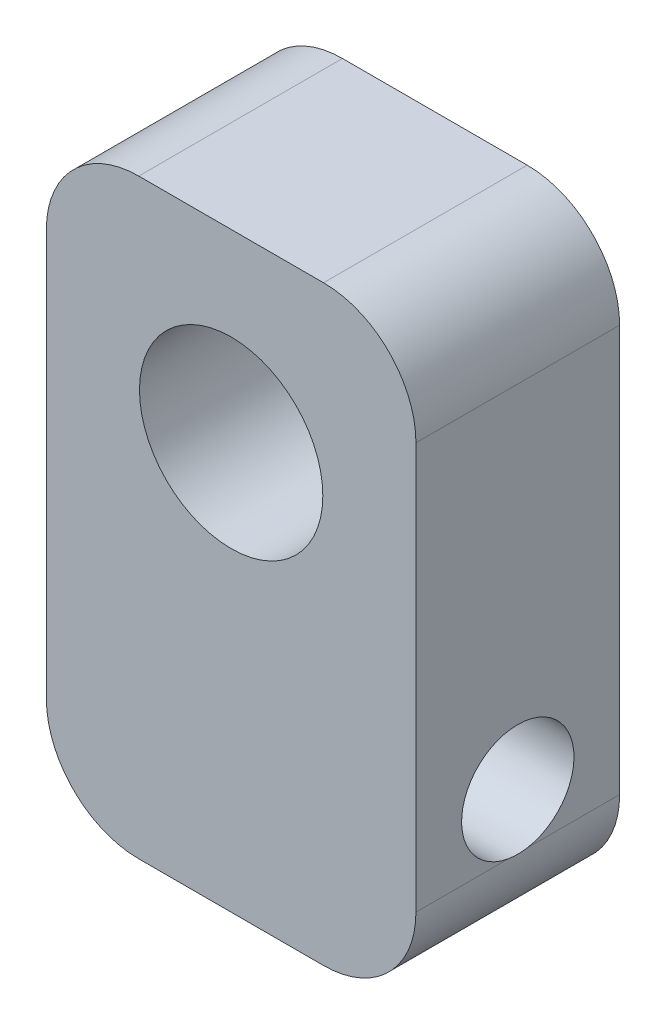
ISO-10303-21;
HEADER;
FILE_DESCRIPTION(('STEP AP214'),'2;1');
FILE_NAME('part.step','',(''),(''),'','','');
FILE_SCHEMA(('AUTOMOTIVE_DESIGN { 1 0 10303 214 1 1 1 1 }'));
ENDSEC;
DATA;
#1=APPLICATION_CONTEXT('core data for automotive mechanical design processes');
#2=APPLICATION_PROTOCOL_DEFINITION('international standard','automotive_design',2000,#1);
#3=PRODUCT_CONTEXT('',#1,'mechanical');
#4=PRODUCT('Part','Part','',(#3));
#5=PRODUCT_RELATED_PRODUCT_CATEGORY('part','',(#4));
#6=PRODUCT_DEFINITION_FORMATION('','',#4);
#7=PRODUCT_DEFINITION_CONTEXT('part definition',#1,'design');
#8=PRODUCT_DEFINITION('design','',#6,#7);
#9=PRODUCT_DEFINITION_SHAPE('','',#8);
#10=(LENGTH_UNIT() NAMED_UNIT(*) SI_UNIT(.MILLI.,.METRE.));
#11=(NAMED_UNIT(*) PLANE_ANGLE_UNIT() SI_UNIT($,.RADIAN.));
#12=(NAMED_UNIT(*) SI_UNIT($,.STERADIAN.) SOLID_ANGLE_UNIT());
#13=UNCERTAINTY_MEASURE_WITH_UNIT(LENGTH_MEASURE(1.E-05),#10,'distance_accuracy_value','');
#14=(GEOMETRIC_REPRESENTATION_CONTEXT(3) GLOBAL_UNCERTAINTY_ASSIGNED_CONTEXT((#13)) GLOBAL_UNIT_ASSIGNED_CONTEXT((#10,
#11,#12)) REPRESENTATION_CONTEXT('',''));
#15=CARTESIAN_POINT('',(0.,0.,0.));
#16=DIRECTION('',(0.,0.,1.));
#17=DIRECTION('',(1.,0.,0.));
#18=AXIS2_PLACEMENT_3D('',#15,#16,#17);
#19=CARTESIAN_POINT('',(0.,0.,3.5));
#20=DIRECTION('',(0.,0.,-1.));
#21=DIRECTION('',(-1.,0.,0.));
#22=AXIS2_PLACEMENT_3D('',#19,#20,#21);
#23=PLANE('',#22);
#24=DIRECTION('',(0.,1.,0.));
#25=VECTOR('',#24,1.);
#26=CARTESIAN_POINT('',(6.35,0.,3.5));
#27=LINE('',#26,#25);
#28=CARTESIAN_POINT('',(6.35,1.5875,3.5));
#29=VERTEX_POINT('',#28);
#30=CARTESIAN_POINT('',(6.35,8.5725,3.5));
#31=VERTEX_POINT('',#30);
#32=EDGE_CURVE('E239',#29,#31,#27,.T.);
#33=ORIENTED_EDGE('',*,*,#32,.T.);
#34=CARTESIAN_POINT('',(4.7625,8.5725,3.5));
#35=DIRECTION('',(0.,0.,-1.));
#36=DIRECTION('',(-1.,0.,0.));
#37=AXIS2_PLACEMENT_3D('',#34,#35,#36);
#38=CIRCLE('',#37,1.5875);
#39=CARTESIAN_POINT('',(4.7625,10.16,3.5));
#40=VERTEX_POINT('',#39);
#41=EDGE_CURVE('E148',#31,#40,#38,.F.);
#42=ORIENTED_EDGE('',*,*,#41,.T.);
#43=DIRECTION('',(-1.,0.,0.));
#44=VECTOR('',#43,1.);
#45=CARTESIAN_POINT('',(0.,10.16,3.5));
#46=LINE('',#45,#44);
#47=CARTESIAN_POINT('',(1.5875,10.16,3.5));
#48=VERTEX_POINT('',#47);
#49=EDGE_CURVE('E115',#40,#48,#46,.T.);
#50=ORIENTED_EDGE('',*,*,#49,.T.);
#51=CARTESIAN_POINT('',(1.5875,8.5725,3.5));
#52=DIRECTION('',(0.,0.,-1.));
#53=DIRECTION('',(-1.,0.,0.));
#54=AXIS2_PLACEMENT_3D('',#51,#52,#53);
#55=CIRCLE('',#54,1.5875);
#56=CARTESIAN_POINT('',(0.,8.5725,3.5));
#57=VERTEX_POINT('',#56);
#58=EDGE_CURVE('E144',#48,#57,#55,.F.);
#59=ORIENTED_EDGE('',*,*,#58,.T.);
#60=DIRECTION('',(0.,-1.,0.));
#61=VECTOR('',#60,1.);
#62=CARTESIAN_POINT('',(0.,0.,3.5));
#63=LINE('',#62,#61);
#64=CARTESIAN_POINT('',(0.,1.5875,3.5));
#65=VERTEX_POINT('',#64);
#66=EDGE_CURVE('E123',#57,#65,#63,.T.);
#67=ORIENTED_EDGE('',*,*,#66,.T.);
#68=CARTESIAN_POINT('',(1.5875,1.5875,3.5));
#69=DIRECTION('',(0.,0.,-1.));
#70=DIRECTION('',(-1.,0.,0.));
#71=AXIS2_PLACEMENT_3D('',#68,#69,#70);
#72=CIRCLE('',#71,1.5875);
#73=CARTESIAN_POINT('',(1.5875,0.,3.5));
#74=VERTEX_POINT('',#73);
#75=EDGE_CURVE('E142',#65,#74,#72,.F.);
#76=ORIENTED_EDGE('',*,*,#75,.T.);
#77=DIRECTION('',(1.,0.,0.));
#78=VECTOR('',#77,1.);
#79=CARTESIAN_POINT('',(0.,0.,3.5));
#80=LINE('',#79,#78);
#81=CARTESIAN_POINT('',(4.7625,0.,3.5));
#82=VERTEX_POINT('',#81);
#83=EDGE_CURVE('E127',#74,#82,#80,.T.);
#84=ORIENTED_EDGE('',*,*,#83,.T.);
#85=CARTESIAN_POINT('',(4.7625,1.5875,3.5));
#86=DIRECTION('',(0.,0.,-1.));
#87=DIRECTION('',(-1.,0.,0.));
#88=AXIS2_PLACEMENT_3D('',#85,#86,#87);
#89=CIRCLE('',#88,1.5875);
#90=EDGE_CURVE('E146',#82,#29,#89,.F.);
#91=ORIENTED_EDGE('',*,*,#90,.T.);
#92=EDGE_LOOP('',(#33,#42,#50,#59,#67,#76,#84,#91));
#93=FACE_BOUND('',#92,.T.);
#94=CARTESIAN_POINT('',(3.175,6.985,3.5));
#95=DIRECTION('',(0.,0.,1.));
#96=DIRECTION('',(1.,0.,0.));
#97=AXIS2_PLACEMENT_3D('',#94,#95,#96);
#98=CIRCLE('',#97,1.575000025);
#99=CARTESIAN_POINT('',(4.750000025,6.985,3.5));
#100=VERTEX_POINT('',#99);
#101=EDGE_CURVE('E235',#100,#100,#98,.T.);
#102=ORIENTED_EDGE('',*,*,#101,.F.);
#103=EDGE_LOOP('',(#102));
#104=FACE_BOUND('',#103,.T.);
#105=ADVANCED_FACE('F17',(#93,#104),#23,.F.);
#106=CARTESIAN_POINT('',(0.,0.,0.));
#107=DIRECTION('',(0.,0.,-1.));
#108=DIRECTION('',(-1.,0.,0.));
#109=AXIS2_PLACEMENT_3D('',#106,#107,#108);
#110=PLANE('',#109);
#111=DIRECTION('',(-1.,0.,0.));
#112=VECTOR('',#111,1.);
#113=CARTESIAN_POINT('',(0.,10.16,0.));
#114=LINE('',#113,#112);
#115=CARTESIAN_POINT('',(4.7625,10.16,0.));
#116=VERTEX_POINT('',#115);
#117=CARTESIAN_POINT('',(1.5875,10.16,0.));
#118=VERTEX_POINT('',#117);
#119=EDGE_CURVE('E112',#116,#118,#114,.T.);
#120=ORIENTED_EDGE('',*,*,#119,.F.);
#121=CARTESIAN_POINT('',(4.7625,8.5725,0.));
#122=DIRECTION('',(0.,0.,-1.));
#123=DIRECTION('',(-1.,0.,0.));
#124=AXIS2_PLACEMENT_3D('',#121,#122,#123);
#125=CIRCLE('',#124,1.5875);
#126=CARTESIAN_POINT('',(6.35,8.5725,0.));
#127=VERTEX_POINT('',#126);
#128=EDGE_CURVE('E95',#116,#127,#125,.T.);
#129=ORIENTED_EDGE('',*,*,#128,.T.);
#130=DIRECTION('',(0.,1.,0.));
#131=VECTOR('',#130,1.);
#132=CARTESIAN_POINT('',(6.35,0.,0.));
#133=LINE('',#132,#131);
#134=CARTESIAN_POINT('',(6.35,1.5875,0.));
#135=VERTEX_POINT('',#134);
#136=EDGE_CURVE('E124',#135,#127,#133,.T.);
#137=ORIENTED_EDGE('',*,*,#136,.F.);
#138=CARTESIAN_POINT('',(4.7625,1.5875,0.));
#139=DIRECTION('',(0.,0.,-1.));
#140=DIRECTION('',(-1.,0.,0.));
#141=AXIS2_PLACEMENT_3D('',#138,#139,#140);
#142=CIRCLE('',#141,1.5875);
#143=CARTESIAN_POINT('',(4.7625,0.,0.));
#144=VERTEX_POINT('',#143);
#145=EDGE_CURVE('E106',#135,#144,#142,.T.);
#146=ORIENTED_EDGE('',*,*,#145,.T.);
#147=DIRECTION('',(1.,0.,0.));
#148=VECTOR('',#147,1.);
#149=CARTESIAN_POINT('',(0.,0.,0.));
#150=LINE('',#149,#148);
#151=CARTESIAN_POINT('',(1.5875,0.,0.));
#152=VERTEX_POINT('',#151);
#153=EDGE_CURVE('E129',#152,#144,#150,.T.);
#154=ORIENTED_EDGE('',*,*,#153,.F.);
#155=CARTESIAN_POINT('',(1.5875,1.5875,0.));
#156=DIRECTION('',(0.,0.,-1.));
#157=DIRECTION('',(-1.,0.,0.));
#158=AXIS2_PLACEMENT_3D('',#155,#156,#157);
#159=CIRCLE('',#158,1.5875);
#160=CARTESIAN_POINT('',(0.,1.5875,0.));
#161=VERTEX_POINT('',#160);
#162=EDGE_CURVE('E116',#152,#161,#159,.T.);
#163=ORIENTED_EDGE('',*,*,#162,.T.);
#164=DIRECTION('',(0.,-1.,0.));
#165=VECTOR('',#164,1.);
#166=CARTESIAN_POINT('',(0.,0.,0.));
#167=LINE('',#166,#165);
#168=CARTESIAN_POINT('',(0.,8.5725,0.));
#169=VERTEX_POINT('',#168);
#170=EDGE_CURVE('E234',#169,#161,#167,.T.);
#171=ORIENTED_EDGE('',*,*,#170,.F.);
#172=CARTESIAN_POINT('',(1.5875,8.5725,0.));
#173=DIRECTION('',(0.,0.,-1.));
#174=DIRECTION('',(-1.,0.,0.));
#175=AXIS2_PLACEMENT_3D('',#172,#173,#174);
#176=CIRCLE('',#175,1.5875);
#177=EDGE_CURVE('E122',#169,#118,#176,.T.);
#178=ORIENTED_EDGE('',*,*,#177,.T.);
#179=EDGE_LOOP('',(#120,#129,#137,#146,#154,#163,#171,#178));
#180=FACE_BOUND('',#179,.T.);
#181=CARTESIAN_POINT('',(3.175,6.985,0.));
#182=DIRECTION('',(0.,0.,1.));
#183=DIRECTION('',(1.,0.,0.));
#184=AXIS2_PLACEMENT_3D('',#181,#182,#183);
#185=CIRCLE('',#184,1.575000025);
#186=CARTESIAN_POINT('',(4.750000025,6.985,0.));
#187=VERTEX_POINT('',#186);
#188=EDGE_CURVE('E242',#187,#187,#185,.T.);
#189=ORIENTED_EDGE('',*,*,#188,.T.);
#190=EDGE_LOOP('',(#189));
#191=FACE_BOUND('',#190,.T.);
#192=ADVANCED_FACE('F119',(#180,#191),#110,.T.);
#193=CARTESIAN_POINT('',(0.,0.,3.5));
#194=DIRECTION('',(1.,0.,0.));
#195=DIRECTION('',(0.,0.,-1.));
#196=AXIS2_PLACEMENT_3D('',#193,#194,#195);
#197=PLANE('',#196);
#198=ORIENTED_EDGE('',*,*,#66,.F.);
#199=DIRECTION('',(0.,0.,-1.));
#200=VECTOR('',#199,1.);
#201=CARTESIAN_POINT('',(0.,8.5725,3.5));
#202=LINE('',#201,#200);
#203=EDGE_CURVE('E11',#57,#169,#202,.T.);
#204=ORIENTED_EDGE('',*,*,#203,.T.);
#205=ORIENTED_EDGE('',*,*,#170,.T.);
#206=DIRECTION('',(0.,0.,-1.));
#207=VECTOR('',#206,1.);
#208=CARTESIAN_POINT('',(0.,1.5875,3.5));
#209=LINE('',#208,#207);
#210=CARTESIAN_POINT('',(0.,1.5875,1.59393978726145));
#211=VERTEX_POINT('',#210);
#212=EDGE_CURVE('E26',#161,#211,#209,.F.);
#213=ORIENTED_EDGE('',*,*,#212,.T.);
#214=CARTESIAN_POINT('',(0.,2.54,1.75));
#215=DIRECTION('',(1.,0.,0.));
#216=DIRECTION('',(0.,0.,-1.));
#217=AXIS2_PLACEMENT_3D('',#214,#215,#216);
#218=CIRCLE('',#217,0.9652);
#219=CARTESIAN_POINT('',(0.,1.5875,1.90606021273855));
#220=VERTEX_POINT('',#219);
#221=EDGE_CURVE('E212',#211,#220,#218,.T.);
#222=ORIENTED_EDGE('',*,*,#221,.T.);
#223=DIRECTION('',(0.,0.,-1.));
#224=VECTOR('',#223,1.);
#225=CARTESIAN_POINT('',(0.,1.5875,3.5));
#226=LINE('',#225,#224);
#227=EDGE_CURVE('E211',#220,#65,#226,.F.);
#228=ORIENTED_EDGE('',*,*,#227,.T.);
#229=EDGE_LOOP('',(#198,#204,#205,#213,#222,#228));
#230=FACE_BOUND('',#229,.T.);
#231=ADVANCED_FACE('F177',(#230),#197,.F.);
#232=CARTESIAN_POINT('',(0.,0.,3.5));
#233=DIRECTION('',(0.,1.,0.));
#234=DIRECTION('',(0.,0.,1.));
#235=AXIS2_PLACEMENT_3D('',#232,#233,#234);
#236=PLANE('',#235);
#237=ORIENTED_EDGE('',*,*,#153,.T.);
#238=DIRECTION('',(0.,0.,-1.));
#239=VECTOR('',#238,1.);
#240=CARTESIAN_POINT('',(4.7625,0.,3.5));
#241=LINE('',#240,#239);
#242=EDGE_CURVE('E213',#144,#82,#241,.F.);
#243=ORIENTED_EDGE('',*,*,#242,.T.);
#244=ORIENTED_EDGE('',*,*,#83,.F.);
#245=DIRECTION('',(0.,0.,-1.));
#246=VECTOR('',#245,1.);
#247=CARTESIAN_POINT('',(1.5875,0.,3.5));
#248=LINE('',#247,#246);
#249=EDGE_CURVE('E215',#74,#152,#248,.T.);
#250=ORIENTED_EDGE('',*,*,#249,.T.);
#251=EDGE_LOOP('',(#237,#243,#244,#250));
#252=FACE_BOUND('',#251,.T.);
#253=ADVANCED_FACE('F183',(#252),#236,.F.);
#254=CARTESIAN_POINT('',(6.35,0.,3.5));
#255=DIRECTION('',(-1.,0.,0.));
#256=DIRECTION('',(0.,0.,1.));
#257=AXIS2_PLACEMENT_3D('',#254,#255,#256);
#258=PLANE('',#257);
#259=ORIENTED_EDGE('',*,*,#136,.T.);
#260=DIRECTION('',(0.,0.,-1.));
#261=VECTOR('',#260,1.);
#262=CARTESIAN_POINT('',(6.35,8.5725,3.5));
#263=LINE('',#262,#261);
#264=EDGE_CURVE('E100',#127,#31,#263,.F.);
#265=ORIENTED_EDGE('',*,*,#264,.T.);
#266=ORIENTED_EDGE('',*,*,#32,.F.);
#267=DIRECTION('',(0.,0.,-1.));
#268=VECTOR('',#267,1.);
#269=CARTESIAN_POINT('',(6.35,1.5875,3.5));
#270=LINE('',#269,#268);
#271=CARTESIAN_POINT('',(6.35,1.5875,1.90606021273855));
#272=VERTEX_POINT('',#271);
#273=EDGE_CURVE('E138',#29,#272,#270,.T.);
#274=ORIENTED_EDGE('',*,*,#273,.T.);
#275=CARTESIAN_POINT('',(6.35,2.54,1.75));
#276=DIRECTION('',(1.,0.,0.));
#277=DIRECTION('',(0.,0.,-1.));
#278=AXIS2_PLACEMENT_3D('',#275,#276,#277);
#279=CIRCLE('',#278,0.9652);
#280=CARTESIAN_POINT('',(6.35,1.5875,1.59393978726145));
#281=VERTEX_POINT('',#280);
#282=EDGE_CURVE('E225',#281,#272,#279,.T.);
#283=ORIENTED_EDGE('',*,*,#282,.F.);
#284=DIRECTION('',(0.,0.,-1.));
#285=VECTOR('',#284,1.);
#286=CARTESIAN_POINT('',(6.35,1.5875,3.5));
#287=LINE('',#286,#285);
#288=EDGE_CURVE('E105',#281,#135,#287,.T.);
#289=ORIENTED_EDGE('',*,*,#288,.T.);
#290=EDGE_LOOP('',(#259,#265,#266,#274,#283,#289));
#291=FACE_BOUND('',#290,.T.);
#292=ADVANCED_FACE('F180',(#291),#258,.F.);
#293=CARTESIAN_POINT('',(0.,10.16,3.5));
#294=DIRECTION('',(0.,-1.,0.));
#295=DIRECTION('',(0.,0.,-1.));
#296=AXIS2_PLACEMENT_3D('',#293,#294,#295);
#297=PLANE('',#296);
#298=ORIENTED_EDGE('',*,*,#49,.F.);
#299=DIRECTION('',(0.,0.,-1.));
#300=VECTOR('',#299,1.);
#301=CARTESIAN_POINT('',(4.7625,10.16,3.5));
#302=LINE('',#301,#300);
#303=EDGE_CURVE('E99',#40,#116,#302,.T.);
#304=ORIENTED_EDGE('',*,*,#303,.T.);
#305=ORIENTED_EDGE('',*,*,#119,.T.);
#306=DIRECTION('',(0.,0.,-1.));
#307=VECTOR('',#306,1.);
#308=CARTESIAN_POINT('',(1.5875,10.16,3.5));
#309=LINE('',#308,#307);
#310=EDGE_CURVE('E117',#118,#48,#309,.F.);
#311=ORIENTED_EDGE('',*,*,#310,.T.);
#312=EDGE_LOOP('',(#298,#304,#305,#311));
#313=FACE_BOUND('',#312,.T.);
#314=ADVANCED_FACE('F111',(#313),#297,.F.);
#315=CARTESIAN_POINT('',(3.175,6.985,3.5));
#316=DIRECTION('',(0.,0.,-1.));
#317=DIRECTION('',(-1.,0.,0.));
#318=AXIS2_PLACEMENT_3D('',#315,#316,#317);
#319=CYLINDRICAL_SURFACE('',#318,1.575000025);
#320=ORIENTED_EDGE('',*,*,#101,.T.);
#321=EDGE_LOOP('',(#320));
#322=FACE_BOUND('',#321,.T.);
#323=ORIENTED_EDGE('',*,*,#188,.F.);
#324=EDGE_LOOP('',(#323));
#325=FACE_BOUND('',#324,.T.);
#326=ADVANCED_FACE('F167',(#322,#325),#319,.F.);
#327=CARTESIAN_POINT('',(0.,2.54,1.75));
#328=DIRECTION('',(1.,0.,0.));
#329=DIRECTION('',(0.,0.,-1.));
#330=AXIS2_PLACEMENT_3D('',#327,#328,#329);
#331=CYLINDRICAL_SURFACE('',#330,0.9652);
#332=ORIENTED_EDGE('',*,*,#221,.F.);
#333=CARTESIAN_POINT('',(0.,1.5875,1.59393978726145));
#334=CARTESIAN_POINT('',(3.38672085160489E-05,1.57903333333333,1.6459598581743));
#335=CARTESIAN_POINT('',(5.08008127740759E-05,1.5748,1.69797992908715));
#336=CARTESIAN_POINT('',(5.08008127740864E-05,1.5748,1.80202007091285));
#337=CARTESIAN_POINT('',(3.38672085160698E-05,1.57903333333333,1.8540401418257));
#338=CARTESIAN_POINT('',(0.,1.5875,1.90606021273855));
#339=B_SPLINE_CURVE_WITH_KNOTS('',3,(#333,#334,#335,#336,#337,#338),.UNSPECIFIED.,.F.,.F.,(4,2,
4),(0.,0.156576123916523,0.313152247833047),.UNSPECIFIED.);
#340=EDGE_CURVE('E38',#211,#220,#339,.T.);
#341=ORIENTED_EDGE('',*,*,#340,.T.);
#342=EDGE_LOOP('',(#332,#341));
#343=FACE_BOUND('',#342,.T.);
#344=ORIENTED_EDGE('',*,*,#282,.T.);
#345=CARTESIAN_POINT('',(6.35,1.5875,1.90606021273855));
#346=CARTESIAN_POINT('',(6.34996613279148,1.57903333333333,1.8540401418257));
#347=CARTESIAN_POINT('',(6.34994919918723,1.5748,1.80202007091285));
#348=CARTESIAN_POINT('',(6.34994919918723,1.5748,1.69797992908715));
#349=CARTESIAN_POINT('',(6.34996613279148,1.57903333333333,1.6459598581743));
#350=CARTESIAN_POINT('',(6.35,1.5875,1.59393978726145));
#351=B_SPLINE_CURVE_WITH_KNOTS('',3,(#345,#346,#347,#348,#349,#350),.UNSPECIFIED.,.F.,.F.,(4,2,
4),(0.,0.156576123916523,0.313152247833047),.UNSPECIFIED.);
#352=EDGE_CURVE('E156',#272,#281,#351,.T.);
#353=ORIENTED_EDGE('',*,*,#352,.T.);
#354=EDGE_LOOP('',(#344,#353));
#355=FACE_BOUND('',#354,.T.);
#356=ADVANCED_FACE('F163',(#343,#355),#331,.F.);
#357=CARTESIAN_POINT('',(4.7625,8.5725,3.5));
#358=DIRECTION('',(0.,0.,-1.));
#359=DIRECTION('',(-1.,0.,0.));
#360=AXIS2_PLACEMENT_3D('',#357,#358,#359);
#361=CYLINDRICAL_SURFACE('',#360,1.5875);
#362=ORIENTED_EDGE('',*,*,#41,.F.);
#363=ORIENTED_EDGE('',*,*,#264,.F.);
#364=ORIENTED_EDGE('',*,*,#128,.F.);
#365=ORIENTED_EDGE('',*,*,#303,.F.);
#366=EDGE_LOOP('',(#362,#363,#364,#365));
#367=FACE_BOUND('',#366,.T.);
#368=ADVANCED_FACE('F98',(#367),#361,.T.);
#369=CARTESIAN_POINT('',(4.7625,1.5875,3.5));
#370=DIRECTION('',(0.,0.,-1.));
#371=DIRECTION('',(-1.,0.,0.));
#372=AXIS2_PLACEMENT_3D('',#369,#370,#371);
#373=CYLINDRICAL_SURFACE('',#372,1.5875);
#374=ORIENTED_EDGE('',*,*,#90,.F.);
#375=ORIENTED_EDGE('',*,*,#242,.F.);
#376=ORIENTED_EDGE('',*,*,#145,.F.);
#377=ORIENTED_EDGE('',*,*,#288,.F.);
#378=ORIENTED_EDGE('',*,*,#352,.F.);
#379=ORIENTED_EDGE('',*,*,#273,.F.);
#380=EDGE_LOOP('',(#374,#375,#376,#377,#378,#379));
#381=FACE_BOUND('',#380,.T.);
#382=ADVANCED_FACE('F191',(#381),#373,.T.);
#383=CARTESIAN_POINT('',(1.5875,8.5725,3.5));
#384=DIRECTION('',(0.,0.,-1.));
#385=DIRECTION('',(-1.,0.,0.));
#386=AXIS2_PLACEMENT_3D('',#383,#384,#385);
#387=CYLINDRICAL_SURFACE('',#386,1.5875);
#388=ORIENTED_EDGE('',*,*,#58,.F.);
#389=ORIENTED_EDGE('',*,*,#310,.F.);
#390=ORIENTED_EDGE('',*,*,#177,.F.);
#391=ORIENTED_EDGE('',*,*,#203,.F.);
#392=EDGE_LOOP('',(#388,#389,#390,#391));
#393=FACE_BOUND('',#392,.T.);
#394=ADVANCED_FACE('F194',(#393),#387,.T.);
#395=CARTESIAN_POINT('',(1.5875,1.5875,3.5));
#396=DIRECTION('',(0.,0.,-1.));
#397=DIRECTION('',(-1.,0.,0.));
#398=AXIS2_PLACEMENT_3D('',#395,#396,#397);
#399=CYLINDRICAL_SURFACE('',#398,1.5875);
#400=ORIENTED_EDGE('',*,*,#340,.F.);
#401=ORIENTED_EDGE('',*,*,#212,.F.);
#402=ORIENTED_EDGE('',*,*,#162,.F.);
#403=ORIENTED_EDGE('',*,*,#249,.F.);
#404=ORIENTED_EDGE('',*,*,#75,.F.);
#405=ORIENTED_EDGE('',*,*,#227,.F.);
#406=EDGE_LOOP('',(#400,#401,#402,#403,#404,#405));
#407=FACE_BOUND('',#406,.T.);
#408=ADVANCED_FACE('F19',(#407),#399,.T.);
#409=CLOSED_SHELL('',(#105,#192,#231,#253,#292,#314,#326,#356,#368,#382,#394,#408));
#410=MANIFOLD_SOLID_BREP('B1',#409);
#411=ADVANCED_BREP_SHAPE_REPRESENTATION('',(#18,#410),#14);
#412=SHAPE_DEFINITION_REPRESENTATION(#9,#411);
ENDSEC;
END-ISO-10303-21;
